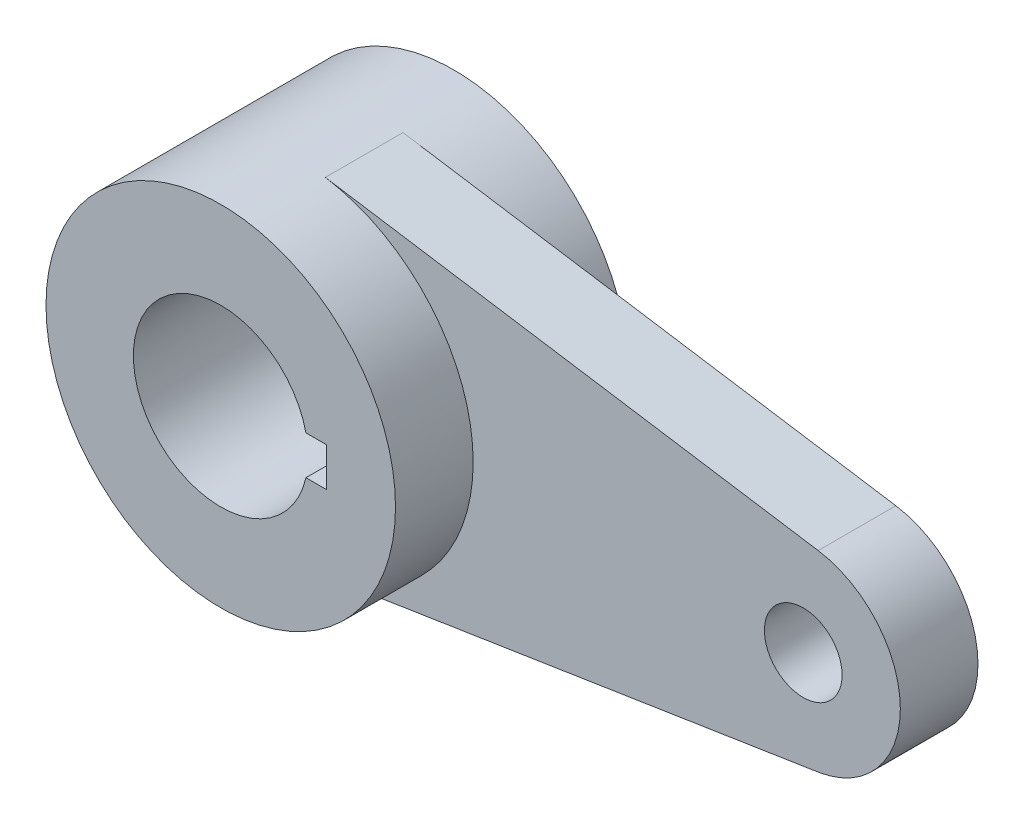
ISO-10303-21;
HEADER;
FILE_DESCRIPTION(('STEP AP214'),'2;1');
FILE_NAME('part.step','',(''),(''),'','','');
FILE_SCHEMA(('AUTOMOTIVE_DESIGN { 1 0 10303 214 1 1 1 1 }'));
ENDSEC;
DATA;
#1=APPLICATION_CONTEXT('core data for automotive mechanical design processes');
#2=APPLICATION_PROTOCOL_DEFINITION('international standard','automotive_design',2000,#1);
#3=PRODUCT_CONTEXT('',#1,'mechanical');
#4=PRODUCT('Part','Part','',(#3));
#5=PRODUCT_RELATED_PRODUCT_CATEGORY('part','',(#4));
#6=PRODUCT_DEFINITION_FORMATION('','',#4);
#7=PRODUCT_DEFINITION_CONTEXT('part definition',#1,'design');
#8=PRODUCT_DEFINITION('design','',#6,#7);
#9=PRODUCT_DEFINITION_SHAPE('','',#8);
#10=(LENGTH_UNIT() NAMED_UNIT(*) SI_UNIT(.MILLI.,.METRE.));
#11=(NAMED_UNIT(*) PLANE_ANGLE_UNIT() SI_UNIT($,.RADIAN.));
#12=(NAMED_UNIT(*) SI_UNIT($,.STERADIAN.) SOLID_ANGLE_UNIT());
#13=UNCERTAINTY_MEASURE_WITH_UNIT(LENGTH_MEASURE(1.E-05),#10,'distance_accuracy_value','');
#14=(GEOMETRIC_REPRESENTATION_CONTEXT(3) GLOBAL_UNCERTAINTY_ASSIGNED_CONTEXT((#13)) GLOBAL_UNIT_ASSIGNED_CONTEXT((#10,
#11,#12)) REPRESENTATION_CONTEXT('',''));
#15=CARTESIAN_POINT('',(0.,0.,0.));
#16=DIRECTION('',(0.,0.,1.));
#17=DIRECTION('',(1.,0.,0.));
#18=AXIS2_PLACEMENT_3D('',#15,#16,#17);
#19=CARTESIAN_POINT('',(-0.0317958997466394,0.136414209212535,19.05));
#20=DIRECTION('',(0.,0.,1.));
#21=DIRECTION('',(1.,0.,0.));
#22=AXIS2_PLACEMENT_3D('',#19,#20,#21);
#23=PLANE('',#22);
#24=DIRECTION('',(-1.,0.,0.));
#25=VECTOR('',#24,1.);
#26=CARTESIAN_POINT('',(17.2402041002534,3.31141420921253,19.05));
#27=LINE('',#26,#25);
#28=CARTESIAN_POINT('',(17.2402041002534,3.31141420921253,19.05));
#29=VERTEX_POINT('',#28);
#30=CARTESIAN_POINT('',(13.8984600652384,3.31141420921253,19.05));
#31=VERTEX_POINT('',#30);
#32=EDGE_CURVE('E177',#29,#31,#27,.T.);
#33=ORIENTED_EDGE('',*,*,#32,.F.);
#34=DIRECTION('',(0.,1.,0.));
#35=VECTOR('',#34,1.);
#36=CARTESIAN_POINT('',(17.2402041002534,-3.03858579078746,19.05));
#37=LINE('',#36,#35);
#38=CARTESIAN_POINT('',(17.2402041002534,-3.03858579078746,19.05));
#39=VERTEX_POINT('',#38);
#40=EDGE_CURVE('E126',#39,#29,#37,.T.);
#41=ORIENTED_EDGE('',*,*,#40,.F.);
#42=DIRECTION('',(1.,0.,0.));
#43=VECTOR('',#42,1.);
#44=CARTESIAN_POINT('',(17.2402041002534,-3.03858579078746,19.05));
#45=LINE('',#44,#43);
#46=CARTESIAN_POINT('',(13.8984600652384,-3.03858579078746,19.05));
#47=VERTEX_POINT('',#46);
#48=EDGE_CURVE('E111',#47,#39,#45,.T.);
#49=ORIENTED_EDGE('',*,*,#48,.F.);
#50=CARTESIAN_POINT('',(-0.0317958997466394,0.136414209212535,19.05));
#51=DIRECTION('',(0.,0.,1.));
#52=DIRECTION('',(1.,0.,0.));
#53=AXIS2_PLACEMENT_3D('',#50,#51,#52);
#54=CIRCLE('',#53,14.2875);
#55=EDGE_CURVE('E124',#31,#47,#54,.T.);
#56=ORIENTED_EDGE('',*,*,#55,.F.);
#57=EDGE_LOOP('',(#33,#41,#49,#56));
#58=FACE_BOUND('',#57,.T.);
#59=CARTESIAN_POINT('',(-0.0317958997466394,0.136414209212535,19.05));
#60=DIRECTION('',(0.,0.,1.));
#61=DIRECTION('',(1.,0.,0.));
#62=AXIS2_PLACEMENT_3D('',#59,#60,#61);
#63=CIRCLE('',#62,28.575);
#64=CARTESIAN_POINT('',(28.5432041002534,0.136414209212535,19.05));
#65=VERTEX_POINT('',#64);
#66=EDGE_CURVE('E11',#65,#65,#63,.T.);
#67=ORIENTED_EDGE('',*,*,#66,.T.);
#68=EDGE_LOOP('',(#67));
#69=FACE_BOUND('',#68,.T.);
#70=ADVANCED_FACE('F43',(#58,#69),#23,.T.);
#71=CARTESIAN_POINT('',(-0.0317958997466394,0.136414209212535,-19.05));
#72=DIRECTION('',(0.,0.,1.));
#73=DIRECTION('',(1.,0.,0.));
#74=AXIS2_PLACEMENT_3D('',#71,#72,#73);
#75=PLANE('',#74);
#76=CARTESIAN_POINT('',(-0.0317958997466394,0.136414209212535,-19.05));
#77=DIRECTION('',(0.,0.,1.));
#78=DIRECTION('',(1.,0.,0.));
#79=AXIS2_PLACEMENT_3D('',#76,#77,#78);
#80=CIRCLE('',#79,28.575);
#81=CARTESIAN_POINT('',(28.5432041002534,0.136414209212535,-19.05));
#82=VERTEX_POINT('',#81);
#83=EDGE_CURVE('E52',#82,#82,#80,.T.);
#84=ORIENTED_EDGE('',*,*,#83,.F.);
#85=EDGE_LOOP('',(#84));
#86=FACE_BOUND('',#85,.T.);
#87=DIRECTION('',(0.,1.,0.));
#88=VECTOR('',#87,1.);
#89=CARTESIAN_POINT('',(17.2402041002534,-3.03858579078746,-19.05));
#90=LINE('',#89,#88);
#91=CARTESIAN_POINT('',(17.2402041002534,-3.03858579078746,-19.05));
#92=VERTEX_POINT('',#91);
#93=CARTESIAN_POINT('',(17.2402041002534,3.31141420921253,-19.05));
#94=VERTEX_POINT('',#93);
#95=EDGE_CURVE('E173',#92,#94,#90,.T.);
#96=ORIENTED_EDGE('',*,*,#95,.T.);
#97=DIRECTION('',(-1.,0.,0.));
#98=VECTOR('',#97,1.);
#99=CARTESIAN_POINT('',(17.2402041002534,3.31141420921253,-19.05));
#100=LINE('',#99,#98);
#101=CARTESIAN_POINT('',(13.8984600652384,3.31141420921253,-19.05));
#102=VERTEX_POINT('',#101);
#103=EDGE_CURVE('E118',#94,#102,#100,.T.);
#104=ORIENTED_EDGE('',*,*,#103,.T.);
#105=CARTESIAN_POINT('',(-0.0317958997466394,0.136414209212535,-19.05));
#106=DIRECTION('',(0.,0.,1.));
#107=DIRECTION('',(1.,0.,0.));
#108=AXIS2_PLACEMENT_3D('',#105,#106,#107);
#109=CIRCLE('',#108,14.2875);
#110=CARTESIAN_POINT('',(13.8984600652384,-3.03858579078746,-19.05));
#111=VERTEX_POINT('',#110);
#112=EDGE_CURVE('E131',#102,#111,#109,.T.);
#113=ORIENTED_EDGE('',*,*,#112,.T.);
#114=DIRECTION('',(1.,0.,0.));
#115=VECTOR('',#114,1.);
#116=CARTESIAN_POINT('',(17.2402041002534,-3.03858579078746,-19.05));
#117=LINE('',#116,#115);
#118=EDGE_CURVE('E60',#111,#92,#117,.T.);
#119=ORIENTED_EDGE('',*,*,#118,.T.);
#120=EDGE_LOOP('',(#96,#104,#113,#119));
#121=FACE_BOUND('',#120,.T.);
#122=ADVANCED_FACE('F186',(#86,#121),#75,.F.);
#123=CARTESIAN_POINT('',(-0.0317958997466394,0.136414209212535,19.05));
#124=DIRECTION('',(0.,0.,-1.));
#125=DIRECTION('',(-1.,0.,0.));
#126=AXIS2_PLACEMENT_3D('',#123,#124,#125);
#127=CYLINDRICAL_SURFACE('',#126,28.575);
#128=DIRECTION('',(0.,0.,-1.));
#129=VECTOR('',#128,1.);
#130=CARTESIAN_POINT('',(4.36435794640721,-28.0983950935072,6.35));
#131=LINE('',#130,#129);
#132=CARTESIAN_POINT('',(4.36435794640721,-28.0983950935072,6.35));
#133=VERTEX_POINT('',#132);
#134=CARTESIAN_POINT('',(4.36435794640721,-28.0983950935072,-6.35));
#135=VERTEX_POINT('',#134);
#136=EDGE_CURVE('E68',#133,#135,#131,.T.);
#137=ORIENTED_EDGE('',*,*,#136,.F.);
#138=CARTESIAN_POINT('',(-0.0317958997466403,0.136414209212538,6.35));
#139=DIRECTION('',(0.,0.,-1.));
#140=DIRECTION('',(1.,0.,0.));
#141=AXIS2_PLACEMENT_3D('',#138,#139,#140);
#142=CIRCLE('',#141,28.575);
#143=CARTESIAN_POINT('',(4.36435794640721,28.3712235119322,6.35));
#144=VERTEX_POINT('',#143);
#145=EDGE_CURVE('E149',#144,#133,#142,.T.);
#146=ORIENTED_EDGE('',*,*,#145,.F.);
#147=DIRECTION('',(0.,0.,-1.));
#148=VECTOR('',#147,1.);
#149=CARTESIAN_POINT('',(4.36435794640721,28.3712235119322,6.35));
#150=LINE('',#149,#148);
#151=CARTESIAN_POINT('',(4.36435794640721,28.3712235119322,-6.35));
#152=VERTEX_POINT('',#151);
#153=EDGE_CURVE('E143',#144,#152,#150,.T.);
#154=ORIENTED_EDGE('',*,*,#153,.T.);
#155=CARTESIAN_POINT('',(-0.0317958997466403,0.136414209212538,-6.35));
#156=DIRECTION('',(0.,0.,-1.));
#157=DIRECTION('',(1.,0.,0.));
#158=AXIS2_PLACEMENT_3D('',#155,#156,#157);
#159=CIRCLE('',#158,28.575);
#160=EDGE_CURVE('E154',#152,#135,#159,.T.);
#161=ORIENTED_EDGE('',*,*,#160,.T.);
#162=EDGE_LOOP('',(#137,#146,#154,#161));
#163=FACE_BOUND('',#162,.T.);
#164=ORIENTED_EDGE('',*,*,#66,.F.);
#165=EDGE_LOOP('',(#164));
#166=FACE_BOUND('',#165,.T.);
#167=ORIENTED_EDGE('',*,*,#83,.T.);
#168=EDGE_LOOP('',(#167));
#169=FACE_BOUND('',#168,.T.);
#170=ADVANCED_FACE('F45',(#163,#166,#169),#127,.T.);
#171=CARTESIAN_POINT('',(-0.0317958997466394,0.136414209212535,19.05));
#172=DIRECTION('',(0.,0.,-1.));
#173=DIRECTION('',(-1.,0.,0.));
#174=AXIS2_PLACEMENT_3D('',#171,#172,#173);
#175=CYLINDRICAL_SURFACE('',#174,14.2875);
#176=DIRECTION('',(0.,0.,1.));
#177=VECTOR('',#176,1.);
#178=CARTESIAN_POINT('',(13.8984600652384,3.31141420921253,-19.05));
#179=LINE('',#178,#177);
#180=EDGE_CURVE('E130',#102,#31,#179,.T.);
#181=ORIENTED_EDGE('',*,*,#180,.T.);
#182=ORIENTED_EDGE('',*,*,#55,.T.);
#183=DIRECTION('',(0.,0.,1.));
#184=VECTOR('',#183,1.);
#185=CARTESIAN_POINT('',(13.8984600652384,-3.03858579078746,-19.05));
#186=LINE('',#185,#184);
#187=EDGE_CURVE('E108',#111,#47,#186,.T.);
#188=ORIENTED_EDGE('',*,*,#187,.F.);
#189=ORIENTED_EDGE('',*,*,#112,.F.);
#190=EDGE_LOOP('',(#181,#182,#188,#189));
#191=FACE_BOUND('',#190,.T.);
#192=ADVANCED_FACE('F129',(#191),#175,.F.);
#193=CARTESIAN_POINT('',(84.9605117925611,-15.5495909589651,6.35));
#194=DIRECTION('',(-0.153846153846154,0.988094813743472,0.));
#195=DIRECTION('',(-0.988094813743472,-0.153846153846154,0.));
#196=AXIS2_PLACEMENT_3D('',#193,#194,#195);
#197=PLANE('',#196);
#198=DIRECTION('',(0.988094813743472,0.153846153846154,0.));
#199=VECTOR('',#198,1.);
#200=CARTESIAN_POINT('',(84.9605117925611,-15.5495909589651,-6.35));
#201=LINE('',#200,#199);
#202=CARTESIAN_POINT('',(84.9605117925611,-15.5495909589651,-6.35));
#203=VERTEX_POINT('',#202);
#204=EDGE_CURVE('E152',#135,#203,#201,.T.);
#205=ORIENTED_EDGE('',*,*,#204,.T.);
#206=DIRECTION('',(0.,0.,-1.));
#207=VECTOR('',#206,1.);
#208=CARTESIAN_POINT('',(84.9605117925611,-15.5495909589651,6.35));
#209=LINE('',#208,#207);
#210=CARTESIAN_POINT('',(84.9605117925611,-15.5495909589651,6.35));
#211=VERTEX_POINT('',#210);
#212=EDGE_CURVE('E137',#211,#203,#209,.T.);
#213=ORIENTED_EDGE('',*,*,#212,.F.);
#214=DIRECTION('',(0.988094813743472,0.153846153846154,0.));
#215=VECTOR('',#214,1.);
#216=CARTESIAN_POINT('',(84.9605117925611,-15.5495909589651,6.35));
#217=LINE('',#216,#215);
#218=EDGE_CURVE('E161',#133,#211,#217,.T.);
#219=ORIENTED_EDGE('',*,*,#218,.F.);
#220=ORIENTED_EDGE('',*,*,#136,.T.);
#221=EDGE_LOOP('',(#205,#213,#219,#220));
#222=FACE_BOUND('',#221,.T.);
#223=ADVANCED_FACE('F198',(#222),#197,.F.);
#224=CARTESIAN_POINT('',(82.5182041002534,0.136414209212534,6.35));
#225=DIRECTION('',(0.,0.,-1.));
#226=DIRECTION('',(-1.,0.,0.));
#227=AXIS2_PLACEMENT_3D('',#224,#225,#226);
#228=CYLINDRICAL_SURFACE('',#227,15.875);
#229=CARTESIAN_POINT('',(82.5182041002534,0.136414209212534,-6.35));
#230=DIRECTION('',(0.,0.,1.));
#231=DIRECTION('',(-1.,0.,0.));
#232=AXIS2_PLACEMENT_3D('',#229,#230,#231);
#233=CIRCLE('',#232,15.875);
#234=CARTESIAN_POINT('',(84.9605117925611,15.8224193773901,-6.35));
#235=VERTEX_POINT('',#234);
#236=EDGE_CURVE('E150',#203,#235,#233,.T.);
#237=ORIENTED_EDGE('',*,*,#236,.T.);
#238=DIRECTION('',(0.,0.,-1.));
#239=VECTOR('',#238,1.);
#240=CARTESIAN_POINT('',(84.9605117925611,15.8224193773901,6.35));
#241=LINE('',#240,#239);
#242=CARTESIAN_POINT('',(84.9605117925611,15.8224193773901,6.35));
#243=VERTEX_POINT('',#242);
#244=EDGE_CURVE('E140',#243,#235,#241,.T.);
#245=ORIENTED_EDGE('',*,*,#244,.F.);
#246=CARTESIAN_POINT('',(82.5182041002534,0.136414209212534,6.35));
#247=DIRECTION('',(0.,0.,1.));
#248=DIRECTION('',(-1.,0.,0.));
#249=AXIS2_PLACEMENT_3D('',#246,#247,#248);
#250=CIRCLE('',#249,15.875);
#251=EDGE_CURVE('E159',#211,#243,#250,.T.);
#252=ORIENTED_EDGE('',*,*,#251,.F.);
#253=ORIENTED_EDGE('',*,*,#212,.T.);
#254=EDGE_LOOP('',(#237,#245,#252,#253));
#255=FACE_BOUND('',#254,.T.);
#256=ADVANCED_FACE('F201',(#255),#228,.T.);
#257=CARTESIAN_POINT('',(4.36435794640721,28.3712235119322,6.35));
#258=DIRECTION('',(-0.153846153846154,-0.988094813743471,0.));
#259=DIRECTION('',(0.988094813743472,-0.153846153846154,0.));
#260=AXIS2_PLACEMENT_3D('',#257,#258,#259);
#261=PLANE('',#260);
#262=DIRECTION('',(-0.988094813743472,0.153846153846154,0.));
#263=VECTOR('',#262,1.);
#264=CARTESIAN_POINT('',(4.36435794640721,28.3712235119322,-6.35));
#265=LINE('',#264,#263);
#266=EDGE_CURVE('E146',#235,#152,#265,.T.);
#267=ORIENTED_EDGE('',*,*,#266,.T.);
#268=ORIENTED_EDGE('',*,*,#153,.F.);
#269=DIRECTION('',(-0.988094813743472,0.153846153846154,0.));
#270=VECTOR('',#269,1.);
#271=CARTESIAN_POINT('',(4.36435794640721,28.3712235119322,6.35));
#272=LINE('',#271,#270);
#273=EDGE_CURVE('E145',#243,#144,#272,.T.);
#274=ORIENTED_EDGE('',*,*,#273,.F.);
#275=ORIENTED_EDGE('',*,*,#244,.T.);
#276=EDGE_LOOP('',(#267,#268,#274,#275));
#277=FACE_BOUND('',#276,.T.);
#278=ADVANCED_FACE('F205',(#277),#261,.F.);
#279=CARTESIAN_POINT('',(-0.0317958997466403,0.136414209212538,6.35));
#280=DIRECTION('',(0.,0.,1.));
#281=DIRECTION('',(1.,0.,0.));
#282=AXIS2_PLACEMENT_3D('',#279,#280,#281);
#283=PLANE('',#282);
#284=CARTESIAN_POINT('',(82.5182041002534,0.136414209212535,6.35));
#285=DIRECTION('',(0.,0.,1.));
#286=DIRECTION('',(1.,0.,0.));
#287=AXIS2_PLACEMENT_3D('',#284,#285,#286);
#288=CIRCLE('',#287,6.35);
#289=CARTESIAN_POINT('',(88.8682041002534,0.136414209212535,6.34999999999999));
#290=VERTEX_POINT('',#289);
#291=EDGE_CURVE('E156',#290,#290,#288,.T.);
#292=ORIENTED_EDGE('',*,*,#291,.F.);
#293=EDGE_LOOP('',(#292));
#294=FACE_BOUND('',#293,.T.);
#295=ORIENTED_EDGE('',*,*,#145,.T.);
#296=ORIENTED_EDGE('',*,*,#218,.T.);
#297=ORIENTED_EDGE('',*,*,#251,.T.);
#298=ORIENTED_EDGE('',*,*,#273,.T.);
#299=EDGE_LOOP('',(#295,#296,#297,#298));
#300=FACE_BOUND('',#299,.T.);
#301=ADVANCED_FACE('F209',(#294,#300),#283,.T.);
#302=CARTESIAN_POINT('',(-0.0317958997466403,0.136414209212538,-6.35));
#303=DIRECTION('',(0.,0.,1.));
#304=DIRECTION('',(1.,0.,0.));
#305=AXIS2_PLACEMENT_3D('',#302,#303,#304);
#306=PLANE('',#305);
#307=CARTESIAN_POINT('',(82.5182041002534,0.136414209212535,-6.35));
#308=DIRECTION('',(0.,0.,1.));
#309=DIRECTION('',(1.,0.,0.));
#310=AXIS2_PLACEMENT_3D('',#307,#308,#309);
#311=CIRCLE('',#310,6.35);
#312=CARTESIAN_POINT('',(88.8682041002534,0.136414209212535,-6.35));
#313=VERTEX_POINT('',#312);
#314=EDGE_CURVE('E47',#313,#313,#311,.T.);
#315=ORIENTED_EDGE('',*,*,#314,.T.);
#316=EDGE_LOOP('',(#315));
#317=FACE_BOUND('',#316,.T.);
#318=ORIENTED_EDGE('',*,*,#160,.F.);
#319=ORIENTED_EDGE('',*,*,#266,.F.);
#320=ORIENTED_EDGE('',*,*,#236,.F.);
#321=ORIENTED_EDGE('',*,*,#204,.F.);
#322=EDGE_LOOP('',(#318,#319,#320,#321));
#323=FACE_BOUND('',#322,.T.);
#324=ADVANCED_FACE('F211',(#317,#323),#306,.F.);
#325=CARTESIAN_POINT('',(82.5182041002534,0.136414209212535,-19.05));
#326=DIRECTION('',(0.,0.,1.));
#327=DIRECTION('',(1.,0.,0.));
#328=AXIS2_PLACEMENT_3D('',#325,#326,#327);
#329=CYLINDRICAL_SURFACE('',#328,6.35);
#330=CARTESIAN_POINT('',(88.8682041002534,0.136414209212535,6.34999999999999));
#331=CARTESIAN_POINT('',(88.8682041002534,0.136414209212535,6.21770833333333));
#332=CARTESIAN_POINT('',(88.8682041002534,0.136414209212535,6.08541666666666));
#333=CARTESIAN_POINT('',(88.8682041002534,0.136414209212535,5.82083333333333));
#334=CARTESIAN_POINT('',(88.8682041002534,0.136414209212535,5.68854166666666));
#335=CARTESIAN_POINT('',(88.8682041002534,0.136414209212535,5.42395833333333));
#336=CARTESIAN_POINT('',(88.8682041002534,0.136414209212535,5.29166666666666));
#337=CARTESIAN_POINT('',(88.8682041002534,0.136414209212535,5.02708333333333));
#338=CARTESIAN_POINT('',(88.8682041002534,0.136414209212535,4.89479166666666));
#339=CARTESIAN_POINT('',(88.8682041002534,0.136414209212535,4.63020833333333));
#340=CARTESIAN_POINT('',(88.8682041002534,0.136414209212535,4.49791666666666));
#341=CARTESIAN_POINT('',(88.8682041002534,0.136414209212535,4.23333333333333));
#342=CARTESIAN_POINT('',(88.8682041002534,0.136414209212535,4.10104166666666));
#343=CARTESIAN_POINT('',(88.8682041002534,0.136414209212535,3.83645833333333));
#344=CARTESIAN_POINT('',(88.8682041002534,0.136414209212535,3.70416666666666));
#345=CARTESIAN_POINT('',(88.8682041002534,0.136414209212535,3.43958333333333));
#346=CARTESIAN_POINT('',(88.8682041002534,0.136414209212535,3.30729166666666));
#347=CARTESIAN_POINT('',(88.8682041002534,0.136414209212535,3.04270833333333));
#348=CARTESIAN_POINT('',(88.8682041002534,0.136414209212535,2.91041666666666));
#349=CARTESIAN_POINT('',(88.8682041002534,0.136414209212535,2.64583333333333));
#350=CARTESIAN_POINT('',(88.8682041002534,0.136414209212535,2.51354166666666));
#351=CARTESIAN_POINT('',(88.8682041002534,0.136414209212535,2.24895833333333));
#352=CARTESIAN_POINT('',(88.8682041002534,0.136414209212535,2.11666666666666));
#353=CARTESIAN_POINT('',(88.8682041002534,0.136414209212535,1.85208333333333));
#354=CARTESIAN_POINT('',(88.8682041002534,0.136414209212535,1.71979166666666));
#355=CARTESIAN_POINT('',(88.8682041002534,0.136414209212535,1.45520833333333));
#356=CARTESIAN_POINT('',(88.8682041002534,0.136414209212535,1.32291666666666));
#357=CARTESIAN_POINT('',(88.8682041002534,0.136414209212535,1.05833333333333));
#358=CARTESIAN_POINT('',(88.8682041002534,0.136414209212535,0.926041666666663));
#359=CARTESIAN_POINT('',(88.8682041002534,0.136414209212535,0.66145833333333));
#360=CARTESIAN_POINT('',(88.8682041002534,0.136414209212535,0.529166666666664));
#361=CARTESIAN_POINT('',(88.8682041002534,0.136414209212535,0.264583333333331));
#362=CARTESIAN_POINT('',(88.8682041002534,0.136414209212535,0.132291666666664));
#363=CARTESIAN_POINT('',(88.8682041002534,0.136414209212535,-0.132291666666671));
#364=CARTESIAN_POINT('',(88.8682041002534,0.136414209212535,-0.264583333333338));
#365=CARTESIAN_POINT('',(88.8682041002534,0.136414209212535,-0.529166666666671));
#366=CARTESIAN_POINT('',(88.8682041002534,0.136414209212535,-0.661458333333337));
#367=CARTESIAN_POINT('',(88.8682041002534,0.136414209212535,-0.92604166666667));
#368=CARTESIAN_POINT('',(88.8682041002534,0.136414209212535,-1.05833333333334));
#369=CARTESIAN_POINT('',(88.8682041002534,0.136414209212535,-1.32291666666667));
#370=CARTESIAN_POINT('',(88.8682041002534,0.136414209212535,-1.45520833333334));
#371=CARTESIAN_POINT('',(88.8682041002534,0.136414209212535,-1.71979166666667));
#372=CARTESIAN_POINT('',(88.8682041002534,0.136414209212535,-1.85208333333334));
#373=CARTESIAN_POINT('',(88.8682041002534,0.136414209212535,-2.11666666666667));
#374=CARTESIAN_POINT('',(88.8682041002534,0.136414209212535,-2.24895833333334));
#375=CARTESIAN_POINT('',(88.8682041002534,0.136414209212535,-2.51354166666667));
#376=CARTESIAN_POINT('',(88.8682041002534,0.136414209212535,-2.64583333333334));
#377=CARTESIAN_POINT('',(88.8682041002534,0.136414209212535,-2.91041666666667));
#378=CARTESIAN_POINT('',(88.8682041002534,0.136414209212535,-3.04270833333334));
#379=CARTESIAN_POINT('',(88.8682041002534,0.136414209212535,-3.30729166666667));
#380=CARTESIAN_POINT('',(88.8682041002534,0.136414209212535,-3.43958333333333));
#381=CARTESIAN_POINT('',(88.8682041002534,0.136414209212535,-3.70416666666667));
#382=CARTESIAN_POINT('',(88.8682041002534,0.136414209212535,-3.83645833333333));
#383=CARTESIAN_POINT('',(88.8682041002534,0.136414209212535,-4.10104166666667));
#384=CARTESIAN_POINT('',(88.8682041002534,0.136414209212535,-4.23333333333333));
#385=CARTESIAN_POINT('',(88.8682041002534,0.136414209212535,-4.49791666666667));
#386=CARTESIAN_POINT('',(88.8682041002534,0.136414209212535,-4.63020833333333));
#387=CARTESIAN_POINT('',(88.8682041002534,0.136414209212535,-4.89479166666667));
#388=CARTESIAN_POINT('',(88.8682041002534,0.136414209212535,-5.02708333333333));
#389=CARTESIAN_POINT('',(88.8682041002534,0.136414209212535,-5.29166666666667));
#390=CARTESIAN_POINT('',(88.8682041002534,0.136414209212535,-5.42395833333333));
#391=CARTESIAN_POINT('',(88.8682041002534,0.136414209212535,-5.68854166666667));
#392=CARTESIAN_POINT('',(88.8682041002534,0.136414209212535,-5.82083333333333));
#393=CARTESIAN_POINT('',(88.8682041002534,0.136414209212535,-6.08541666666667));
#394=CARTESIAN_POINT('',(88.8682041002534,0.136414209212535,-6.21770833333333));
#395=CARTESIAN_POINT('',(88.8682041002534,0.136414209212535,-6.35));
#396=B_SPLINE_CURVE_WITH_KNOTS('',3,(#330,#331,#332,#333,#334,#335,#336,#337,#338,#339,#340,
#341,#342,#343,#344,#345,#346,#347,#348,#349,#350,#351,#352,#353,#354,#355,#356,#357,#358,#359,
#360,#361,#362,#363,#364,#365,#366,#367,#368,#369,#370,#371,#372,#373,#374,#375,#376,#377,#378,
#379,#380,#381,#382,#383,#384,#385,#386,#387,#388,#389,#390,#391,#392,#393,#394,#395),
.UNSPECIFIED.,.F.,.F.,(4,2,2,2,2,2,2,2,2,2,2,2,2,2,2,2,2,2,2,2,2,2,2,2,2,2,2,2,2,2,2,2,4),(0.,
0.396875000000001,0.793749999999999,1.190625,1.5875,1.984375,2.38125,2.778125,3.175,3.571875,
3.96875,4.365625,4.7625,5.159375,5.55625,5.953125,6.35,6.746875,7.14375,7.540625,7.9375,
8.334375,8.73125,9.128125,9.525,9.92187499999999,10.31875,10.715625,11.1125,11.509375,11.90625,
12.303125,12.7),.UNSPECIFIED.);
#397=EDGE_CURVE('BSEAM214',#290,#313,#396,.T.);
#398=ORIENTED_EDGE('',*,*,#291,.T.);
#399=ORIENTED_EDGE('',*,*,#314,.F.);
#400=ORIENTED_EDGE('',*,*,#397,.T.);
#401=ORIENTED_EDGE('',*,*,#397,.F.);
#402=EDGE_LOOP('',(#398,#400,#399,#401));
#403=FACE_BOUND('',#402,.T.);
#404=ADVANCED_FACE('F214',(#403),#329,.F.);
#405=CARTESIAN_POINT('',(17.2402041002534,3.31141420921253,-19.05));
#406=DIRECTION('',(0.,1.,0.));
#407=DIRECTION('',(0.,0.,1.));
#408=AXIS2_PLACEMENT_3D('',#405,#406,#407);
#409=PLANE('',#408);
#410=ORIENTED_EDGE('',*,*,#180,.F.);
#411=ORIENTED_EDGE('',*,*,#103,.F.);
#412=DIRECTION('',(0.,0.,1.));
#413=VECTOR('',#412,1.);
#414=CARTESIAN_POINT('',(17.2402041002534,3.31141420921253,-19.05));
#415=LINE('',#414,#413);
#416=EDGE_CURVE('E168',#94,#29,#415,.T.);
#417=ORIENTED_EDGE('',*,*,#416,.T.);
#418=ORIENTED_EDGE('',*,*,#32,.T.);
#419=EDGE_LOOP('',(#410,#411,#417,#418));
#420=FACE_BOUND('',#419,.T.);
#421=ADVANCED_FACE('F184',(#420),#409,.F.);
#422=CARTESIAN_POINT('',(17.2402041002534,-3.03858579078746,-19.05));
#423=DIRECTION('',(1.,0.,0.));
#424=DIRECTION('',(0.,0.,-1.));
#425=AXIS2_PLACEMENT_3D('',#422,#423,#424);
#426=PLANE('',#425);
#427=ORIENTED_EDGE('',*,*,#416,.F.);
#428=ORIENTED_EDGE('',*,*,#95,.F.);
#429=DIRECTION('',(0.,0.,1.));
#430=VECTOR('',#429,1.);
#431=CARTESIAN_POINT('',(17.2402041002534,-3.03858579078746,-19.05));
#432=LINE('',#431,#430);
#433=EDGE_CURVE('E117',#92,#39,#432,.T.);
#434=ORIENTED_EDGE('',*,*,#433,.T.);
#435=ORIENTED_EDGE('',*,*,#40,.T.);
#436=EDGE_LOOP('',(#427,#428,#434,#435));
#437=FACE_BOUND('',#436,.T.);
#438=ADVANCED_FACE('F180',(#437),#426,.F.);
#439=CARTESIAN_POINT('',(17.2402041002534,-3.03858579078746,-19.05));
#440=DIRECTION('',(0.,-1.,0.));
#441=DIRECTION('',(0.,0.,-1.));
#442=AXIS2_PLACEMENT_3D('',#439,#440,#441);
#443=PLANE('',#442);
#444=ORIENTED_EDGE('',*,*,#433,.F.);
#445=ORIENTED_EDGE('',*,*,#118,.F.);
#446=ORIENTED_EDGE('',*,*,#187,.T.);
#447=ORIENTED_EDGE('',*,*,#48,.T.);
#448=EDGE_LOOP('',(#444,#445,#446,#447));
#449=FACE_BOUND('',#448,.T.);
#450=ADVANCED_FACE('F110',(#449),#443,.F.);
#451=CLOSED_SHELL('',(#70,#122,#170,#192,#223,#256,#278,#301,#324,#404,#421,#438,#450));
#452=MANIFOLD_SOLID_BREP('B2',#451);
#453=ADVANCED_BREP_SHAPE_REPRESENTATION('',(#18,#452),#14);
#454=SHAPE_DEFINITION_REPRESENTATION(#9,#453);
ENDSEC;
END-ISO-10303-21;
